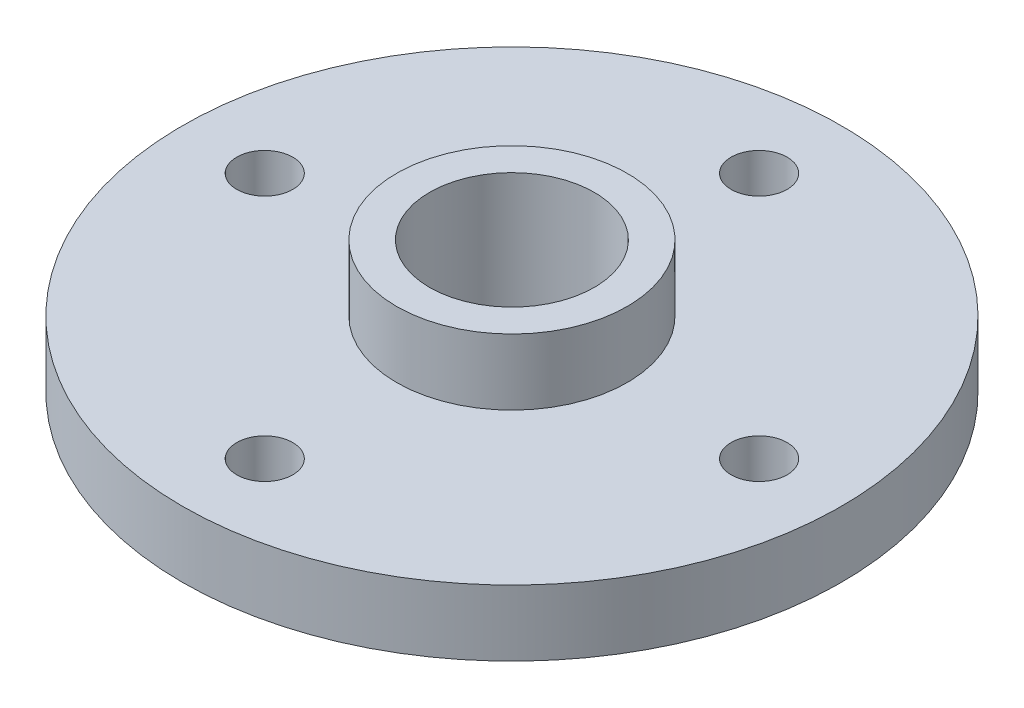
ISO-10303-21;
HEADER;
FILE_DESCRIPTION(('STEP AP214'),'2;1');
FILE_NAME('part.step','',(''),(''),'','','');
FILE_SCHEMA(('AUTOMOTIVE_DESIGN { 1 0 10303 214 1 1 1 1 }'));
ENDSEC;
DATA;
#1=APPLICATION_CONTEXT('core data for automotive mechanical design processes');
#2=APPLICATION_PROTOCOL_DEFINITION('international standard','automotive_design',2000,#1);
#3=PRODUCT_CONTEXT('',#1,'mechanical');
#4=PRODUCT('Part','Part','',(#3));
#5=PRODUCT_RELATED_PRODUCT_CATEGORY('part','',(#4));
#6=PRODUCT_DEFINITION_FORMATION('','',#4);
#7=PRODUCT_DEFINITION_CONTEXT('part definition',#1,'design');
#8=PRODUCT_DEFINITION('design','',#6,#7);
#9=PRODUCT_DEFINITION_SHAPE('','',#8);
#10=(LENGTH_UNIT() NAMED_UNIT(*) SI_UNIT(.MILLI.,.METRE.));
#11=(NAMED_UNIT(*) PLANE_ANGLE_UNIT() SI_UNIT($,.RADIAN.));
#12=(NAMED_UNIT(*) SI_UNIT($,.STERADIAN.) SOLID_ANGLE_UNIT());
#13=UNCERTAINTY_MEASURE_WITH_UNIT(LENGTH_MEASURE(1.E-05),#10,'distance_accuracy_value','');
#14=(GEOMETRIC_REPRESENTATION_CONTEXT(3) GLOBAL_UNCERTAINTY_ASSIGNED_CONTEXT((#13)) GLOBAL_UNIT_ASSIGNED_CONTEXT((#10,
#11,#12)) REPRESENTATION_CONTEXT('',''));
#15=CARTESIAN_POINT('',(0.,0.,0.));
#16=DIRECTION('',(0.,0.,1.));
#17=DIRECTION('',(1.,0.,0.));
#18=AXIS2_PLACEMENT_3D('',#15,#16,#17);
#19=CARTESIAN_POINT('',(0.,2.,0.));
#20=DIRECTION('',(0.,-1.,0.));
#21=DIRECTION('',(0.,0.,-1.));
#22=AXIS2_PLACEMENT_3D('',#19,#20,#21);
#23=CYLINDRICAL_SURFACE('',#22,10.);
#24=CARTESIAN_POINT('',(0.,2.,0.));
#25=DIRECTION('',(0.,1.,0.));
#26=DIRECTION('',(0.,0.,1.));
#27=AXIS2_PLACEMENT_3D('',#24,#25,#26);
#28=CIRCLE('',#27,10.);
#29=CARTESIAN_POINT('',(0.,2.,10.));
#30=VERTEX_POINT('',#29);
#31=EDGE_CURVE('E38',#30,#30,#28,.T.);
#32=ORIENTED_EDGE('',*,*,#31,.F.);
#33=EDGE_LOOP('',(#32));
#34=FACE_BOUND('',#33,.T.);
#35=CARTESIAN_POINT('',(0.,0.,0.));
#36=DIRECTION('',(0.,1.,0.));
#37=DIRECTION('',(0.,0.,1.));
#38=AXIS2_PLACEMENT_3D('',#35,#36,#37);
#39=CIRCLE('',#38,10.);
#40=CARTESIAN_POINT('',(0.,0.,10.));
#41=VERTEX_POINT('',#40);
#42=EDGE_CURVE('E34',#41,#41,#39,.T.);
#43=ORIENTED_EDGE('',*,*,#42,.T.);
#44=EDGE_LOOP('',(#43));
#45=FACE_BOUND('',#44,.T.);
#46=ADVANCED_FACE('F31',(#34,#45),#23,.T.);
#47=CARTESIAN_POINT('',(0.,2.,0.));
#48=DIRECTION('',(0.,1.,0.));
#49=DIRECTION('',(0.,0.,1.));
#50=AXIS2_PLACEMENT_3D('',#47,#48,#49);
#51=PLANE('',#50);
#52=CARTESIAN_POINT('',(0.,2.,-7.5));
#53=DIRECTION('',(0.,1.,0.));
#54=DIRECTION('',(0.,0.,1.));
#55=AXIS2_PLACEMENT_3D('',#52,#53,#54);
#56=CIRCLE('',#55,0.85);
#57=CARTESIAN_POINT('',(0.,2.,-6.65));
#58=VERTEX_POINT('',#57);
#59=EDGE_CURVE('E72',#58,#58,#56,.T.);
#60=ORIENTED_EDGE('',*,*,#59,.F.);
#61=EDGE_LOOP('',(#60));
#62=FACE_BOUND('',#61,.T.);
#63=CARTESIAN_POINT('',(7.5,2.,0.));
#64=DIRECTION('',(0.,1.,0.));
#65=DIRECTION('',(0.,0.,1.));
#66=AXIS2_PLACEMENT_3D('',#63,#64,#65);
#67=CIRCLE('',#66,0.85);
#68=CARTESIAN_POINT('',(7.5,2.,0.85));
#69=VERTEX_POINT('',#68);
#70=EDGE_CURVE('E66',#69,#69,#67,.T.);
#71=ORIENTED_EDGE('',*,*,#70,.F.);
#72=EDGE_LOOP('',(#71));
#73=FACE_BOUND('',#72,.T.);
#74=CARTESIAN_POINT('',(-7.5,2.,0.));
#75=DIRECTION('',(0.,1.,0.));
#76=DIRECTION('',(0.,0.,1.));
#77=AXIS2_PLACEMENT_3D('',#74,#75,#76);
#78=CIRCLE('',#77,0.85);
#79=CARTESIAN_POINT('',(-7.5,2.,0.85));
#80=VERTEX_POINT('',#79);
#81=EDGE_CURVE('E60',#80,#80,#78,.T.);
#82=ORIENTED_EDGE('',*,*,#81,.F.);
#83=EDGE_LOOP('',(#82));
#84=FACE_BOUND('',#83,.T.);
#85=CARTESIAN_POINT('',(0.,2.,7.5));
#86=DIRECTION('',(0.,1.,0.));
#87=DIRECTION('',(0.,0.,1.));
#88=AXIS2_PLACEMENT_3D('',#85,#86,#87);
#89=CIRCLE('',#88,0.85);
#90=CARTESIAN_POINT('',(0.,2.,8.35));
#91=VERTEX_POINT('',#90);
#92=EDGE_CURVE('E54',#91,#91,#89,.T.);
#93=ORIENTED_EDGE('',*,*,#92,.F.);
#94=EDGE_LOOP('',(#93));
#95=FACE_BOUND('',#94,.T.);
#96=CARTESIAN_POINT('',(0.,2.,0.));
#97=DIRECTION('',(0.,1.,0.));
#98=DIRECTION('',(0.,0.,1.));
#99=AXIS2_PLACEMENT_3D('',#96,#97,#98);
#100=CIRCLE('',#99,3.5);
#101=CARTESIAN_POINT('',(0.,2.,3.5));
#102=VERTEX_POINT('',#101);
#103=EDGE_CURVE('E10',#102,#102,#100,.T.);
#104=ORIENTED_EDGE('',*,*,#103,.F.);
#105=EDGE_LOOP('',(#104));
#106=FACE_BOUND('',#105,.T.);
#107=ORIENTED_EDGE('',*,*,#31,.T.);
#108=EDGE_LOOP('',(#107));
#109=FACE_BOUND('',#108,.T.);
#110=ADVANCED_FACE('F88',(#62,#73,#84,#95,#106,#109),#51,.T.);
#111=CARTESIAN_POINT('',(0.,0.,0.));
#112=DIRECTION('',(0.,1.,0.));
#113=DIRECTION('',(0.,0.,1.));
#114=AXIS2_PLACEMENT_3D('',#111,#112,#113);
#115=PLANE('',#114);
#116=CARTESIAN_POINT('',(0.,0.,-7.5));
#117=DIRECTION('',(0.,1.,0.));
#118=DIRECTION('',(0.,0.,1.));
#119=AXIS2_PLACEMENT_3D('',#116,#117,#118);
#120=CIRCLE('',#119,0.85);
#121=CARTESIAN_POINT('',(0.,0.,-6.65));
#122=VERTEX_POINT('',#121);
#123=EDGE_CURVE('E51',#122,#122,#120,.T.);
#124=ORIENTED_EDGE('',*,*,#123,.T.);
#125=EDGE_LOOP('',(#124));
#126=FACE_BOUND('',#125,.T.);
#127=CARTESIAN_POINT('',(7.5,0.,0.));
#128=DIRECTION('',(0.,1.,0.));
#129=DIRECTION('',(0.,0.,1.));
#130=AXIS2_PLACEMENT_3D('',#127,#128,#129);
#131=CIRCLE('',#130,0.85);
#132=CARTESIAN_POINT('',(7.5,0.,0.85));
#133=VERTEX_POINT('',#132);
#134=EDGE_CURVE('E69',#133,#133,#131,.T.);
#135=ORIENTED_EDGE('',*,*,#134,.T.);
#136=EDGE_LOOP('',(#135));
#137=FACE_BOUND('',#136,.T.);
#138=CARTESIAN_POINT('',(-7.5,0.,0.));
#139=DIRECTION('',(0.,1.,0.));
#140=DIRECTION('',(0.,0.,1.));
#141=AXIS2_PLACEMENT_3D('',#138,#139,#140);
#142=CIRCLE('',#141,0.85);
#143=CARTESIAN_POINT('',(-7.5,0.,0.85));
#144=VERTEX_POINT('',#143);
#145=EDGE_CURVE('E63',#144,#144,#142,.T.);
#146=ORIENTED_EDGE('',*,*,#145,.T.);
#147=EDGE_LOOP('',(#146));
#148=FACE_BOUND('',#147,.T.);
#149=CARTESIAN_POINT('',(0.,0.,7.5));
#150=DIRECTION('',(0.,1.,0.));
#151=DIRECTION('',(0.,0.,1.));
#152=AXIS2_PLACEMENT_3D('',#149,#150,#151);
#153=CIRCLE('',#152,0.85);
#154=CARTESIAN_POINT('',(0.,0.,8.35));
#155=VERTEX_POINT('',#154);
#156=EDGE_CURVE('E57',#155,#155,#153,.T.);
#157=ORIENTED_EDGE('',*,*,#156,.T.);
#158=EDGE_LOOP('',(#157));
#159=FACE_BOUND('',#158,.T.);
#160=CARTESIAN_POINT('',(0.,0.,0.));
#161=DIRECTION('',(0.,1.,0.));
#162=DIRECTION('',(0.,0.,1.));
#163=AXIS2_PLACEMENT_3D('',#160,#161,#162);
#164=CIRCLE('',#163,2.5);
#165=CARTESIAN_POINT('',(0.,0.,2.5));
#166=VERTEX_POINT('',#165);
#167=EDGE_CURVE('E47',#166,#166,#164,.T.);
#168=ORIENTED_EDGE('',*,*,#167,.T.);
#169=EDGE_LOOP('',(#168));
#170=FACE_BOUND('',#169,.T.);
#171=ORIENTED_EDGE('',*,*,#42,.F.);
#172=EDGE_LOOP('',(#171));
#173=FACE_BOUND('',#172,.T.);
#174=ADVANCED_FACE('F78',(#126,#137,#148,#159,#170,#173),#115,.F.);
#175=CARTESIAN_POINT('',(0.,4.,0.));
#176=DIRECTION('',(0.,-1.,0.));
#177=DIRECTION('',(0.,0.,-1.));
#178=AXIS2_PLACEMENT_3D('',#175,#176,#177);
#179=CYLINDRICAL_SURFACE('',#178,3.5);
#180=CARTESIAN_POINT('',(0.,4.,0.));
#181=DIRECTION('',(0.,1.,0.));
#182=DIRECTION('',(0.,0.,1.));
#183=AXIS2_PLACEMENT_3D('',#180,#181,#182);
#184=CIRCLE('',#183,3.5);
#185=CARTESIAN_POINT('',(0.,4.,3.5));
#186=VERTEX_POINT('',#185);
#187=EDGE_CURVE('E44',#186,#186,#184,.T.);
#188=ORIENTED_EDGE('',*,*,#187,.F.);
#189=EDGE_LOOP('',(#188));
#190=FACE_BOUND('',#189,.T.);
#191=ORIENTED_EDGE('',*,*,#103,.T.);
#192=EDGE_LOOP('',(#191));
#193=FACE_BOUND('',#192,.T.);
#194=ADVANCED_FACE('F107',(#190,#193),#179,.T.);
#195=CARTESIAN_POINT('',(0.,4.,0.));
#196=DIRECTION('',(0.,1.,0.));
#197=DIRECTION('',(0.,0.,1.));
#198=AXIS2_PLACEMENT_3D('',#195,#196,#197);
#199=PLANE('',#198);
#200=CARTESIAN_POINT('',(0.,4.,0.));
#201=DIRECTION('',(0.,1.,0.));
#202=DIRECTION('',(0.,0.,1.));
#203=AXIS2_PLACEMENT_3D('',#200,#201,#202);
#204=CIRCLE('',#203,2.5);
#205=CARTESIAN_POINT('',(0.,4.,2.5));
#206=VERTEX_POINT('',#205);
#207=EDGE_CURVE('E48',#206,#206,#204,.T.);
#208=ORIENTED_EDGE('',*,*,#207,.F.);
#209=EDGE_LOOP('',(#208));
#210=FACE_BOUND('',#209,.T.);
#211=ORIENTED_EDGE('',*,*,#187,.T.);
#212=EDGE_LOOP('',(#211));
#213=FACE_BOUND('',#212,.T.);
#214=ADVANCED_FACE('F111',(#210,#213),#199,.T.);
#215=CARTESIAN_POINT('',(0.,0.,0.));
#216=DIRECTION('',(0.,1.,0.));
#217=DIRECTION('',(0.,0.,1.));
#218=AXIS2_PLACEMENT_3D('',#215,#216,#217);
#219=CYLINDRICAL_SURFACE('',#218,2.5);
#220=ORIENTED_EDGE('',*,*,#167,.F.);
#221=EDGE_LOOP('',(#220));
#222=FACE_BOUND('',#221,.T.);
#223=ORIENTED_EDGE('',*,*,#207,.T.);
#224=EDGE_LOOP('',(#223));
#225=FACE_BOUND('',#224,.T.);
#226=ADVANCED_FACE('F117',(#222,#225),#219,.F.);
#227=CARTESIAN_POINT('',(0.,0.,7.5));
#228=DIRECTION('',(0.,1.,0.));
#229=DIRECTION('',(0.,0.,1.));
#230=AXIS2_PLACEMENT_3D('',#227,#228,#229);
#231=CYLINDRICAL_SURFACE('',#230,0.85);
#232=ORIENTED_EDGE('',*,*,#156,.F.);
#233=EDGE_LOOP('',(#232));
#234=FACE_BOUND('',#233,.T.);
#235=ORIENTED_EDGE('',*,*,#92,.T.);
#236=EDGE_LOOP('',(#235));
#237=FACE_BOUND('',#236,.T.);
#238=ADVANCED_FACE('F121',(#234,#237),#231,.F.);
#239=CARTESIAN_POINT('',(-7.5,0.,0.));
#240=DIRECTION('',(0.,1.,0.));
#241=DIRECTION('',(0.,0.,1.));
#242=AXIS2_PLACEMENT_3D('',#239,#240,#241);
#243=CYLINDRICAL_SURFACE('',#242,0.85);
#244=ORIENTED_EDGE('',*,*,#145,.F.);
#245=EDGE_LOOP('',(#244));
#246=FACE_BOUND('',#245,.T.);
#247=ORIENTED_EDGE('',*,*,#81,.T.);
#248=EDGE_LOOP('',(#247));
#249=FACE_BOUND('',#248,.T.);
#250=ADVANCED_FACE('F125',(#246,#249),#243,.F.);
#251=CARTESIAN_POINT('',(7.5,0.,0.));
#252=DIRECTION('',(0.,1.,0.));
#253=DIRECTION('',(0.,0.,1.));
#254=AXIS2_PLACEMENT_3D('',#251,#252,#253);
#255=CYLINDRICAL_SURFACE('',#254,0.85);
#256=ORIENTED_EDGE('',*,*,#134,.F.);
#257=EDGE_LOOP('',(#256));
#258=FACE_BOUND('',#257,.T.);
#259=ORIENTED_EDGE('',*,*,#70,.T.);
#260=EDGE_LOOP('',(#259));
#261=FACE_BOUND('',#260,.T.);
#262=ADVANCED_FACE('F84',(#258,#261),#255,.F.);
#263=CARTESIAN_POINT('',(0.,0.,-7.5));
#264=DIRECTION('',(0.,1.,0.));
#265=DIRECTION('',(0.,0.,1.));
#266=AXIS2_PLACEMENT_3D('',#263,#264,#265);
#267=CYLINDRICAL_SURFACE('',#266,0.85);
#268=ORIENTED_EDGE('',*,*,#123,.F.);
#269=EDGE_LOOP('',(#268));
#270=FACE_BOUND('',#269,.T.);
#271=ORIENTED_EDGE('',*,*,#59,.T.);
#272=EDGE_LOOP('',(#271));
#273=FACE_BOUND('',#272,.T.);
#274=ADVANCED_FACE('F81',(#270,#273),#267,.F.);
#275=CLOSED_SHELL('',(#46,#110,#174,#194,#214,#226,#238,#250,#262,#274));
#276=MANIFOLD_SOLID_BREP('B2',#275);
#277=ADVANCED_BREP_SHAPE_REPRESENTATION('',(#18,#276),#14);
#278=SHAPE_DEFINITION_REPRESENTATION(#9,#277);
ENDSEC;
END-ISO-10303-21;
